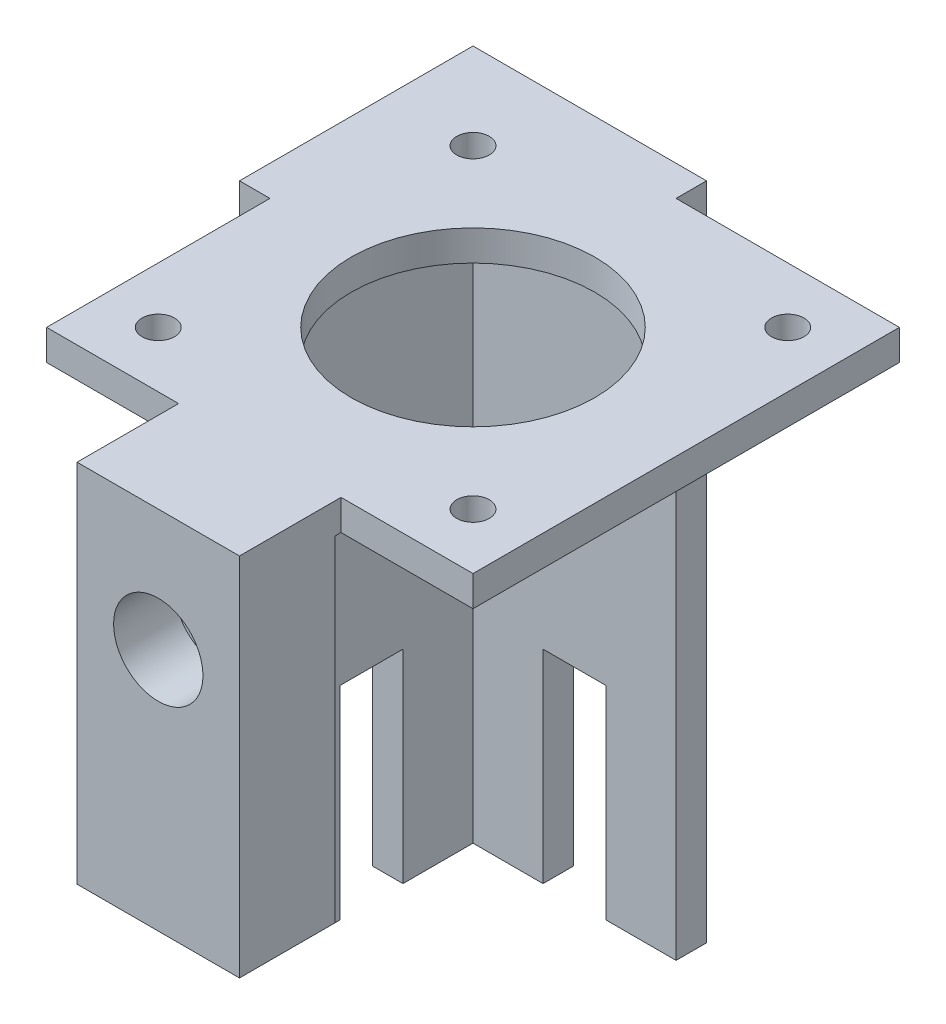
ISO-10303-21;
HEADER;
FILE_DESCRIPTION(('STEP AP214'),'2;1');
FILE_NAME('part.step','',(''),(''),'','','');
FILE_SCHEMA(('AUTOMOTIVE_DESIGN { 1 0 10303 214 1 1 1 1 }'));
ENDSEC;
DATA;
#1=APPLICATION_CONTEXT('core data for automotive mechanical design processes');
#2=APPLICATION_PROTOCOL_DEFINITION('international standard','automotive_design',2000,#1);
#3=PRODUCT_CONTEXT('',#1,'mechanical');
#4=PRODUCT('Part','Part','',(#3));
#5=PRODUCT_RELATED_PRODUCT_CATEGORY('part','',(#4));
#6=PRODUCT_DEFINITION_FORMATION('','',#4);
#7=PRODUCT_DEFINITION_CONTEXT('part definition',#1,'design');
#8=PRODUCT_DEFINITION('design','',#6,#7);
#9=PRODUCT_DEFINITION_SHAPE('','',#8);
#10=(LENGTH_UNIT() NAMED_UNIT(*) SI_UNIT(.MILLI.,.METRE.));
#11=(NAMED_UNIT(*) PLANE_ANGLE_UNIT() SI_UNIT($,.RADIAN.));
#12=(NAMED_UNIT(*) SI_UNIT($,.STERADIAN.) SOLID_ANGLE_UNIT());
#13=UNCERTAINTY_MEASURE_WITH_UNIT(LENGTH_MEASURE(1.E-05),#10,'distance_accuracy_value','');
#14=(GEOMETRIC_REPRESENTATION_CONTEXT(3) GLOBAL_UNCERTAINTY_ASSIGNED_CONTEXT((#13)) GLOBAL_UNIT_ASSIGNED_CONTEXT((#10,
#11,#12)) REPRESENTATION_CONTEXT('',''));
#15=CARTESIAN_POINT('',(0.,0.,0.));
#16=DIRECTION('',(0.,0.,1.));
#17=DIRECTION('',(1.,0.,0.));
#18=AXIS2_PLACEMENT_3D('',#15,#16,#17);
#19=CARTESIAN_POINT('',(-62.,-62.,0.));
#20=DIRECTION('',(0.,-1.,0.));
#21=DIRECTION('',(0.,0.,-1.));
#22=AXIS2_PLACEMENT_3D('',#19,#20,#21);
#23=PLANE('',#22);
#24=DIRECTION('',(-1.,0.,0.));
#25=VECTOR('',#24,1.);
#26=CARTESIAN_POINT('',(-40.999,-62.,-7.89999999999999));
#27=LINE('',#26,#25);
#28=CARTESIAN_POINT('',(-83.,-62.,-7.89999999999999));
#29=VERTEX_POINT('',#28);
#30=CARTESIAN_POINT('',(-86.,-62.,-7.9));
#31=VERTEX_POINT('',#30);
#32=EDGE_CURVE('E505',#29,#31,#27,.T.);
#33=ORIENTED_EDGE('',*,*,#32,.F.);
#34=DIRECTION('',(0.,0.,1.));
#35=VECTOR('',#34,1.);
#36=CARTESIAN_POINT('',(-83.,-62.,-21.));
#37=LINE('',#36,#35);
#38=CARTESIAN_POINT('',(-83.,-62.,-1.));
#39=VERTEX_POINT('',#38);
#40=EDGE_CURVE('E395',#29,#39,#37,.T.);
#41=ORIENTED_EDGE('',*,*,#40,.T.);
#42=DIRECTION('',(-1.,0.,0.));
#43=VECTOR('',#42,1.);
#44=CARTESIAN_POINT('',(-86.,-62.,-1.));
#45=LINE('',#44,#43);
#46=CARTESIAN_POINT('',(-86.,-62.,-1.));
#47=VERTEX_POINT('',#46);
#48=EDGE_CURVE('E541',#39,#47,#45,.T.);
#49=ORIENTED_EDGE('',*,*,#48,.T.);
#50=DIRECTION('',(0.,0.,-1.));
#51=VECTOR('',#50,1.);
#52=CARTESIAN_POINT('',(-86.,-62.,-24.));
#53=LINE('',#52,#51);
#54=EDGE_CURVE('E362',#47,#31,#53,.T.);
#55=ORIENTED_EDGE('',*,*,#54,.T.);
#56=EDGE_LOOP('',(#33,#41,#49,#55));
#57=FACE_BOUND('',#56,.T.);
#58=ADVANCED_FACE('F43',(#57),#23,.T.);
#59=DIRECTION('',(-1.,0.,0.));
#60=VECTOR('',#59,1.);
#61=CARTESIAN_POINT('',(-40.999,-62.,-14.1));
#62=LINE('',#61,#60);
#63=CARTESIAN_POINT('',(-83.,-62.,-14.1));
#64=VERTEX_POINT('',#63);
#65=CARTESIAN_POINT('',(-86.,-62.,-14.1));
#66=VERTEX_POINT('',#65);
#67=EDGE_CURVE('E512',#64,#66,#62,.T.);
#68=ORIENTED_EDGE('',*,*,#67,.T.);
#69=CARTESIAN_POINT('',(-86.,-62.,-24.));
#70=VERTEX_POINT('',#69);
#71=EDGE_CURVE('E369',#66,#70,#53,.T.);
#72=ORIENTED_EDGE('',*,*,#71,.T.);
#73=DIRECTION('',(1.,0.,0.));
#74=VECTOR('',#73,1.);
#75=CARTESIAN_POINT('',(-63.,-62.,-24.));
#76=LINE('',#75,#74);
#77=CARTESIAN_POINT('',(-76.1,-62.,-24.));
#78=VERTEX_POINT('',#77);
#79=EDGE_CURVE('E361',#70,#78,#76,.T.);
#80=ORIENTED_EDGE('',*,*,#79,.T.);
#81=DIRECTION('',(0.,0.,1.));
#82=VECTOR('',#81,1.);
#83=CARTESIAN_POINT('',(-76.1,-62.,0.));
#84=LINE('',#83,#82);
#85=CARTESIAN_POINT('',(-76.1,-62.,-21.));
#86=VERTEX_POINT('',#85);
#87=EDGE_CURVE('E11',#78,#86,#84,.T.);
#88=ORIENTED_EDGE('',*,*,#87,.T.);
#89=DIRECTION('',(-1.,0.,0.));
#90=VECTOR('',#89,1.);
#91=CARTESIAN_POINT('',(-63.,-62.,-21.));
#92=LINE('',#91,#90);
#93=CARTESIAN_POINT('',(-83.,-62.,-21.));
#94=VERTEX_POINT('',#93);
#95=EDGE_CURVE('E375',#86,#94,#92,.T.);
#96=ORIENTED_EDGE('',*,*,#95,.T.);
#97=EDGE_CURVE('E538',#94,#64,#37,.T.);
#98=ORIENTED_EDGE('',*,*,#97,.T.);
#99=EDGE_LOOP('',(#68,#72,#80,#88,#96,#98));
#100=FACE_BOUND('',#99,.T.);
#101=ADVANCED_FACE('F550',(#100),#23,.T.);
#102=CARTESIAN_POINT('',(-41.,3.,21.));
#103=DIRECTION('',(0.,0.,-1.));
#104=DIRECTION('',(1.,0.,0.));
#105=AXIS2_PLACEMENT_3D('',#102,#103,#104);
#106=PLANE('',#105);
#107=DIRECTION('',(0.,1.,0.));
#108=VECTOR('',#107,1.);
#109=CARTESIAN_POINT('',(-70.,3.,21.));
#110=LINE('',#109,#108);
#111=CARTESIAN_POINT('',(-70.,0.,21.));
#112=VERTEX_POINT('',#111);
#113=CARTESIAN_POINT('',(-70.,3.,21.));
#114=VERTEX_POINT('',#113);
#115=EDGE_CURVE('E332',#112,#114,#110,.T.);
#116=ORIENTED_EDGE('',*,*,#115,.T.);
#117=DIRECTION('',(-1.,0.,0.));
#118=VECTOR('',#117,1.);
#119=CARTESIAN_POINT('',(-41.,3.,21.));
#120=LINE('',#119,#118);
#121=CARTESIAN_POINT('',(-83.,3.,21.));
#122=VERTEX_POINT('',#121);
#123=EDGE_CURVE('E301',#114,#122,#120,.T.);
#124=ORIENTED_EDGE('',*,*,#123,.T.);
#125=DIRECTION('',(0.,-1.,0.));
#126=VECTOR('',#125,1.);
#127=CARTESIAN_POINT('',(-83.,3.,21.));
#128=LINE('',#127,#126);
#129=CARTESIAN_POINT('',(-83.,0.,21.));
#130=VERTEX_POINT('',#129);
#131=EDGE_CURVE('E306',#122,#130,#128,.T.);
#132=ORIENTED_EDGE('',*,*,#131,.T.);
#133=DIRECTION('',(-1.,0.,0.));
#134=VECTOR('',#133,1.);
#135=CARTESIAN_POINT('',(-41.,0.,21.));
#136=LINE('',#135,#134);
#137=EDGE_CURVE('E318',#112,#130,#136,.T.);
#138=ORIENTED_EDGE('',*,*,#137,.F.);
#139=EDGE_LOOP('',(#116,#124,#132,#138));
#140=FACE_BOUND('',#139,.T.);
#141=ADVANCED_FACE('F439',(#140),#106,.F.);
#142=DIRECTION('',(0.,-1.,0.));
#143=VECTOR('',#142,1.);
#144=CARTESIAN_POINT('',(-54.,3.,21.));
#145=LINE('',#144,#143);
#146=CARTESIAN_POINT('',(-54.,3.,21.));
#147=VERTEX_POINT('',#146);
#148=CARTESIAN_POINT('',(-54.,0.,21.));
#149=VERTEX_POINT('',#148);
#150=EDGE_CURVE('E240',#147,#149,#145,.T.);
#151=ORIENTED_EDGE('',*,*,#150,.T.);
#152=CARTESIAN_POINT('',(-41.,0.,21.));
#153=VERTEX_POINT('',#152);
#154=EDGE_CURVE('E294',#153,#149,#136,.T.);
#155=ORIENTED_EDGE('',*,*,#154,.F.);
#156=DIRECTION('',(0.,-1.,0.));
#157=VECTOR('',#156,1.);
#158=CARTESIAN_POINT('',(-41.,3.,21.));
#159=LINE('',#158,#157);
#160=CARTESIAN_POINT('',(-41.,3.,21.));
#161=VERTEX_POINT('',#160);
#162=EDGE_CURVE('E325',#161,#153,#159,.T.);
#163=ORIENTED_EDGE('',*,*,#162,.F.);
#164=EDGE_CURVE('E302',#161,#147,#120,.T.);
#165=ORIENTED_EDGE('',*,*,#164,.T.);
#166=EDGE_LOOP('',(#151,#155,#163,#165));
#167=FACE_BOUND('',#166,.T.);
#168=ADVANCED_FACE('F470',(#167),#106,.F.);
#169=CARTESIAN_POINT('',(-62.,3.,0.));
#170=DIRECTION('',(0.,-1.,0.));
#171=DIRECTION('',(0.,0.,-1.));
#172=AXIS2_PLACEMENT_3D('',#169,#170,#171);
#173=PLANE('',#172);
#174=DIRECTION('',(0.,0.,-1.));
#175=VECTOR('',#174,1.);
#176=CARTESIAN_POINT('',(-83.,3.,21.));
#177=LINE('',#176,#175);
#178=CARTESIAN_POINT('',(-83.,3.,-1.));
#179=VERTEX_POINT('',#178);
#180=EDGE_CURVE('E289',#122,#179,#177,.T.);
#181=ORIENTED_EDGE('',*,*,#180,.F.);
#182=ORIENTED_EDGE('',*,*,#123,.F.);
#183=DIRECTION('',(0.,0.,-1.));
#184=VECTOR('',#183,1.);
#185=CARTESIAN_POINT('',(-70.,3.,31.));
#186=LINE('',#185,#184);
#187=CARTESIAN_POINT('',(-70.,3.,31.));
#188=VERTEX_POINT('',#187);
#189=EDGE_CURVE('E245',#188,#114,#186,.T.);
#190=ORIENTED_EDGE('',*,*,#189,.F.);
#191=DIRECTION('',(1.,0.,0.));
#192=VECTOR('',#191,1.);
#193=CARTESIAN_POINT('',(-70.,3.,31.));
#194=LINE('',#193,#192);
#195=CARTESIAN_POINT('',(-54.,3.,31.));
#196=VERTEX_POINT('',#195);
#197=EDGE_CURVE('E428',#188,#196,#194,.T.);
#198=ORIENTED_EDGE('',*,*,#197,.T.);
#199=DIRECTION('',(0.,0.,-1.));
#200=VECTOR('',#199,1.);
#201=CARTESIAN_POINT('',(-54.,3.,31.));
#202=LINE('',#201,#200);
#203=EDGE_CURVE('E235',#196,#147,#202,.T.);
#204=ORIENTED_EDGE('',*,*,#203,.T.);
#205=ORIENTED_EDGE('',*,*,#164,.F.);
#206=DIRECTION('',(0.,0.,1.));
#207=VECTOR('',#206,1.);
#208=CARTESIAN_POINT('',(-41.,3.,21.));
#209=LINE('',#208,#207);
#210=CARTESIAN_POINT('',(-41.,3.,-21.));
#211=VERTEX_POINT('',#210);
#212=EDGE_CURVE('E298',#211,#161,#209,.T.);
#213=ORIENTED_EDGE('',*,*,#212,.F.);
#214=DIRECTION('',(1.,0.,0.));
#215=VECTOR('',#214,1.);
#216=CARTESIAN_POINT('',(-41.,3.,-21.));
#217=LINE('',#216,#215);
#218=CARTESIAN_POINT('',(-63.,3.,-21.));
#219=VERTEX_POINT('',#218);
#220=EDGE_CURVE('E293',#219,#211,#217,.T.);
#221=ORIENTED_EDGE('',*,*,#220,.F.);
#222=DIRECTION('',(0.,0.,1.));
#223=VECTOR('',#222,1.);
#224=CARTESIAN_POINT('',(-63.,3.,-21.));
#225=LINE('',#224,#223);
#226=CARTESIAN_POINT('',(-63.,3.,-24.));
#227=VERTEX_POINT('',#226);
#228=EDGE_CURVE('E391',#227,#219,#225,.T.);
#229=ORIENTED_EDGE('',*,*,#228,.F.);
#230=DIRECTION('',(1.,0.,0.));
#231=VECTOR('',#230,1.);
#232=CARTESIAN_POINT('',(-63.,3.,-24.));
#233=LINE('',#232,#231);
#234=CARTESIAN_POINT('',(-86.,3.,-24.));
#235=VERTEX_POINT('',#234);
#236=EDGE_CURVE('E388',#235,#227,#233,.T.);
#237=ORIENTED_EDGE('',*,*,#236,.F.);
#238=DIRECTION('',(0.,0.,-1.));
#239=VECTOR('',#238,1.);
#240=CARTESIAN_POINT('',(-86.,3.,-24.));
#241=LINE('',#240,#239);
#242=CARTESIAN_POINT('',(-86.,3.,-1.));
#243=VERTEX_POINT('',#242);
#244=EDGE_CURVE('E383',#243,#235,#241,.T.);
#245=ORIENTED_EDGE('',*,*,#244,.F.);
#246=DIRECTION('',(-1.,0.,0.));
#247=VECTOR('',#246,1.);
#248=CARTESIAN_POINT('',(-86.,3.,-1.));
#249=LINE('',#248,#247);
#250=EDGE_CURVE('E379',#179,#243,#249,.T.);
#251=ORIENTED_EDGE('',*,*,#250,.F.);
#252=EDGE_LOOP('',(#181,#182,#190,#198,#204,#205,#213,#221,#229,#237,#245,#251));
#253=FACE_BOUND('',#252,.T.);
#254=CARTESIAN_POINT('',(-77.5,3.,-15.5));
#255=DIRECTION('',(0.,-1.,0.));
#256=DIRECTION('',(0.,0.,1.));
#257=AXIS2_PLACEMENT_3D('',#254,#255,#256);
#258=CIRCLE('',#257,1.6);
#259=CARTESIAN_POINT('',(-77.5,3.,-13.9));
#260=VERTEX_POINT('',#259);
#261=EDGE_CURVE('E281',#260,#260,#258,.T.);
#262=ORIENTED_EDGE('',*,*,#261,.T.);
#263=EDGE_LOOP('',(#262));
#264=FACE_BOUND('',#263,.T.);
#265=CARTESIAN_POINT('',(-62.,3.,0.));
#266=DIRECTION('',(0.,-1.,0.));
#267=DIRECTION('',(0.,0.,1.));
#268=AXIS2_PLACEMENT_3D('',#265,#266,#267);
#269=CIRCLE('',#268,12.);
#270=CARTESIAN_POINT('',(-62.,3.,12.));
#271=VERTEX_POINT('',#270);
#272=EDGE_CURVE('E273',#271,#271,#269,.T.);
#273=ORIENTED_EDGE('',*,*,#272,.T.);
#274=EDGE_LOOP('',(#273));
#275=FACE_BOUND('',#274,.T.);
#276=CARTESIAN_POINT('',(-77.4999999999999,3.,15.5000000000001));
#277=DIRECTION('',(0.,-1.,0.));
#278=DIRECTION('',(0.,0.,1.));
#279=AXIS2_PLACEMENT_3D('',#276,#277,#278);
#280=CIRCLE('',#279,1.6);
#281=CARTESIAN_POINT('',(-77.4999999999999,3.,17.1000000000001));
#282=VERTEX_POINT('',#281);
#283=EDGE_CURVE('E265',#282,#282,#280,.T.);
#284=ORIENTED_EDGE('',*,*,#283,.T.);
#285=EDGE_LOOP('',(#284));
#286=FACE_BOUND('',#285,.T.);
#287=CARTESIAN_POINT('',(-46.4999999999999,3.,15.4999999999999));
#288=DIRECTION('',(0.,-1.,0.));
#289=DIRECTION('',(0.,0.,1.));
#290=AXIS2_PLACEMENT_3D('',#287,#288,#289);
#291=CIRCLE('',#290,1.6);
#292=CARTESIAN_POINT('',(-46.4999999999999,3.,17.0999999999999));
#293=VERTEX_POINT('',#292);
#294=EDGE_CURVE('E257',#293,#293,#291,.T.);
#295=ORIENTED_EDGE('',*,*,#294,.T.);
#296=EDGE_LOOP('',(#295));
#297=FACE_BOUND('',#296,.T.);
#298=CARTESIAN_POINT('',(-46.5000000000002,3.,-15.5000000000002));
#299=DIRECTION('',(0.,-1.,0.));
#300=DIRECTION('',(0.,0.,1.));
#301=AXIS2_PLACEMENT_3D('',#298,#299,#300);
#302=CIRCLE('',#301,1.6);
#303=CARTESIAN_POINT('',(-46.5000000000002,3.,-13.9000000000002));
#304=VERTEX_POINT('',#303);
#305=EDGE_CURVE('E249',#304,#304,#302,.T.);
#306=ORIENTED_EDGE('',*,*,#305,.T.);
#307=EDGE_LOOP('',(#306));
#308=FACE_BOUND('',#307,.T.);
#309=ADVANCED_FACE('F445',(#253,#264,#275,#286,#297,#308),#173,.F.);
#310=CARTESIAN_POINT('',(-62.,0.,0.));
#311=DIRECTION('',(0.,-1.,0.));
#312=DIRECTION('',(0.,0.,-1.));
#313=AXIS2_PLACEMENT_3D('',#310,#311,#312);
#314=PLANE('',#313);
#315=CARTESIAN_POINT('',(-46.4999999999999,0.,15.4999999999999));
#316=DIRECTION('',(0.,-1.,0.));
#317=DIRECTION('',(0.,0.,1.));
#318=AXIS2_PLACEMENT_3D('',#315,#316,#317);
#319=CIRCLE('',#318,1.6);
#320=CARTESIAN_POINT('',(-46.4999999999999,0.,17.0999999999999));
#321=VERTEX_POINT('',#320);
#322=EDGE_CURVE('E253',#321,#321,#319,.T.);
#323=ORIENTED_EDGE('',*,*,#322,.F.);
#324=EDGE_LOOP('',(#323));
#325=FACE_BOUND('',#324,.T.);
#326=CARTESIAN_POINT('',(-62.,0.,0.));
#327=DIRECTION('',(0.,-1.,0.));
#328=DIRECTION('',(0.,0.,1.));
#329=AXIS2_PLACEMENT_3D('',#326,#327,#328);
#330=CIRCLE('',#329,12.);
#331=CARTESIAN_POINT('',(-62.,0.,12.));
#332=VERTEX_POINT('',#331);
#333=EDGE_CURVE('E269',#332,#332,#330,.T.);
#334=ORIENTED_EDGE('',*,*,#333,.F.);
#335=EDGE_LOOP('',(#334));
#336=FACE_BOUND('',#335,.T.);
#337=DIRECTION('',(0.,0.,-1.));
#338=VECTOR('',#337,1.);
#339=CARTESIAN_POINT('',(-83.,0.,21.));
#340=LINE('',#339,#338);
#341=CARTESIAN_POINT('',(-83.,0.,-1.));
#342=VERTEX_POINT('',#341);
#343=EDGE_CURVE('E285',#130,#342,#340,.T.);
#344=ORIENTED_EDGE('',*,*,#343,.T.);
#345=DIRECTION('',(0.,0.,-1.));
#346=VECTOR('',#345,1.);
#347=CARTESIAN_POINT('',(-83.,0.,0.));
#348=LINE('',#347,#346);
#349=CARTESIAN_POINT('',(-83.,0.,-21.));
#350=VERTEX_POINT('',#349);
#351=EDGE_CURVE('E399',#342,#350,#348,.T.);
#352=ORIENTED_EDGE('',*,*,#351,.T.);
#353=DIRECTION('',(1.,0.,0.));
#354=VECTOR('',#353,1.);
#355=CARTESIAN_POINT('',(-41.,0.,-21.));
#356=LINE('',#355,#354);
#357=CARTESIAN_POINT('',(-63.,0.,-21.));
#358=VERTEX_POINT('',#357);
#359=EDGE_CURVE('E311',#350,#358,#356,.T.);
#360=ORIENTED_EDGE('',*,*,#359,.T.);
#361=CARTESIAN_POINT('',(-41.,0.,-21.));
#362=VERTEX_POINT('',#361);
#363=EDGE_CURVE('E310',#358,#362,#356,.T.);
#364=ORIENTED_EDGE('',*,*,#363,.T.);
#365=DIRECTION('',(0.,0.,1.));
#366=VECTOR('',#365,1.);
#367=CARTESIAN_POINT('',(-41.,0.,21.));
#368=LINE('',#367,#366);
#369=EDGE_CURVE('E315',#362,#153,#368,.T.);
#370=ORIENTED_EDGE('',*,*,#369,.T.);
#371=ORIENTED_EDGE('',*,*,#154,.T.);
#372=DIRECTION('',(0.,0.,1.));
#373=VECTOR('',#372,1.);
#374=CARTESIAN_POINT('',(-54.,0.,21.));
#375=LINE('',#374,#373);
#376=CARTESIAN_POINT('',(-54.,0.,21.6));
#377=VERTEX_POINT('',#376);
#378=EDGE_CURVE('E473',#149,#377,#375,.T.);
#379=ORIENTED_EDGE('',*,*,#378,.T.);
#380=DIRECTION('',(-1.,0.,0.));
#381=VECTOR('',#380,1.);
#382=CARTESIAN_POINT('',(-70.,0.,21.6));
#383=LINE('',#382,#381);
#384=CARTESIAN_POINT('',(-70.,0.,21.6));
#385=VERTEX_POINT('',#384);
#386=EDGE_CURVE('E474',#377,#385,#383,.T.);
#387=ORIENTED_EDGE('',*,*,#386,.T.);
#388=DIRECTION('',(0.,0.,-1.));
#389=VECTOR('',#388,1.);
#390=CARTESIAN_POINT('',(-70.,0.,21.));
#391=LINE('',#390,#389);
#392=EDGE_CURVE('E223',#385,#112,#391,.T.);
#393=ORIENTED_EDGE('',*,*,#392,.T.);
#394=ORIENTED_EDGE('',*,*,#137,.T.);
#395=EDGE_LOOP('',(#344,#352,#360,#364,#370,#371,#379,#387,#393,#394));
#396=FACE_BOUND('',#395,.T.);
#397=CARTESIAN_POINT('',(-77.5,0.,-15.5));
#398=DIRECTION('',(0.,-1.,0.));
#399=DIRECTION('',(0.,0.,1.));
#400=AXIS2_PLACEMENT_3D('',#397,#398,#399);
#401=CIRCLE('',#400,1.6);
#402=CARTESIAN_POINT('',(-77.5,0.,-13.9));
#403=VERTEX_POINT('',#402);
#404=EDGE_CURVE('E277',#403,#403,#401,.T.);
#405=ORIENTED_EDGE('',*,*,#404,.F.);
#406=EDGE_LOOP('',(#405));
#407=FACE_BOUND('',#406,.T.);
#408=CARTESIAN_POINT('',(-77.4999999999999,0.,15.5000000000001));
#409=DIRECTION('',(0.,-1.,0.));
#410=DIRECTION('',(0.,0.,1.));
#411=AXIS2_PLACEMENT_3D('',#408,#409,#410);
#412=CIRCLE('',#411,1.6);
#413=CARTESIAN_POINT('',(-77.4999999999999,0.,17.1000000000001));
#414=VERTEX_POINT('',#413);
#415=EDGE_CURVE('E261',#414,#414,#412,.T.);
#416=ORIENTED_EDGE('',*,*,#415,.F.);
#417=EDGE_LOOP('',(#416));
#418=FACE_BOUND('',#417,.T.);
#419=CARTESIAN_POINT('',(-46.5000000000002,0.,-15.5000000000002));
#420=DIRECTION('',(0.,-1.,0.));
#421=DIRECTION('',(0.,0.,1.));
#422=AXIS2_PLACEMENT_3D('',#419,#420,#421);
#423=CIRCLE('',#422,1.6);
#424=CARTESIAN_POINT('',(-46.5000000000002,0.,-13.9000000000002));
#425=VERTEX_POINT('',#424);
#426=EDGE_CURVE('E248',#425,#425,#423,.T.);
#427=ORIENTED_EDGE('',*,*,#426,.F.);
#428=EDGE_LOOP('',(#427));
#429=FACE_BOUND('',#428,.T.);
#430=ADVANCED_FACE('F455',(#325,#336,#396,#407,#418,#429),#314,.T.);
#431=CARTESIAN_POINT('',(-83.,3.,21.));
#432=DIRECTION('',(1.,0.,0.));
#433=DIRECTION('',(0.,0.,1.));
#434=AXIS2_PLACEMENT_3D('',#431,#432,#433);
#435=PLANE('',#434);
#436=ORIENTED_EDGE('',*,*,#343,.F.);
#437=ORIENTED_EDGE('',*,*,#131,.F.);
#438=ORIENTED_EDGE('',*,*,#180,.T.);
#439=DIRECTION('',(0.,1.,0.));
#440=VECTOR('',#439,1.);
#441=CARTESIAN_POINT('',(-83.,-62.,-1.));
#442=LINE('',#441,#440);
#443=EDGE_CURVE('E378',#342,#179,#442,.T.);
#444=ORIENTED_EDGE('',*,*,#443,.F.);
#445=EDGE_LOOP('',(#436,#437,#438,#444));
#446=FACE_BOUND('',#445,.T.);
#447=ADVANCED_FACE('F45',(#446),#435,.F.);
#448=CARTESIAN_POINT('',(-41.,3.,-21.));
#449=DIRECTION('',(0.,0.,1.));
#450=DIRECTION('',(-1.,0.,0.));
#451=AXIS2_PLACEMENT_3D('',#448,#449,#450);
#452=PLANE('',#451);
#453=ORIENTED_EDGE('',*,*,#220,.T.);
#454=DIRECTION('',(0.,-1.,0.));
#455=VECTOR('',#454,1.);
#456=CARTESIAN_POINT('',(-41.,3.,-21.));
#457=LINE('',#456,#455);
#458=EDGE_CURVE('E329',#211,#362,#457,.T.);
#459=ORIENTED_EDGE('',*,*,#458,.T.);
#460=ORIENTED_EDGE('',*,*,#363,.F.);
#461=DIRECTION('',(0.,-1.,0.));
#462=VECTOR('',#461,1.);
#463=CARTESIAN_POINT('',(-63.,3.,-21.));
#464=LINE('',#463,#462);
#465=EDGE_CURVE('E333',#219,#358,#464,.T.);
#466=ORIENTED_EDGE('',*,*,#465,.F.);
#467=EDGE_LOOP('',(#453,#459,#460,#466));
#468=FACE_BOUND('',#467,.T.);
#469=ADVANCED_FACE('F460',(#468),#452,.F.);
#470=CARTESIAN_POINT('',(-41.,3.,21.));
#471=DIRECTION('',(-1.,0.,0.));
#472=DIRECTION('',(0.,0.,-1.));
#473=AXIS2_PLACEMENT_3D('',#470,#471,#472);
#474=PLANE('',#473);
#475=ORIENTED_EDGE('',*,*,#369,.F.);
#476=ORIENTED_EDGE('',*,*,#458,.F.);
#477=ORIENTED_EDGE('',*,*,#212,.T.);
#478=ORIENTED_EDGE('',*,*,#162,.T.);
#479=EDGE_LOOP('',(#475,#476,#477,#478));
#480=FACE_BOUND('',#479,.T.);
#481=ADVANCED_FACE('F464',(#480),#474,.F.);
#482=CARTESIAN_POINT('',(-77.5,3.,-15.5));
#483=DIRECTION('',(0.,-1.,0.));
#484=DIRECTION('',(0.,0.,-1.));
#485=AXIS2_PLACEMENT_3D('',#482,#483,#484);
#486=CYLINDRICAL_SURFACE('',#485,1.6);
#487=ORIENTED_EDGE('',*,*,#261,.F.);
#488=EDGE_LOOP('',(#487));
#489=FACE_BOUND('',#488,.T.);
#490=ORIENTED_EDGE('',*,*,#404,.T.);
#491=EDGE_LOOP('',(#490));
#492=FACE_BOUND('',#491,.T.);
#493=ADVANCED_FACE('F848',(#489,#492),#486,.F.);
#494=CARTESIAN_POINT('',(-62.,3.,0.));
#495=DIRECTION('',(0.,-1.,0.));
#496=DIRECTION('',(0.,0.,-1.));
#497=AXIS2_PLACEMENT_3D('',#494,#495,#496);
#498=CYLINDRICAL_SURFACE('',#497,12.);
#499=ORIENTED_EDGE('',*,*,#272,.F.);
#500=EDGE_LOOP('',(#499));
#501=FACE_BOUND('',#500,.T.);
#502=ORIENTED_EDGE('',*,*,#333,.T.);
#503=EDGE_LOOP('',(#502));
#504=FACE_BOUND('',#503,.T.);
#505=ADVANCED_FACE('F837',(#501,#504),#498,.F.);
#506=CARTESIAN_POINT('',(-77.4999999999999,3.,15.5000000000001));
#507=DIRECTION('',(0.,-1.,0.));
#508=DIRECTION('',(0.,0.,-1.));
#509=AXIS2_PLACEMENT_3D('',#506,#507,#508);
#510=CYLINDRICAL_SURFACE('',#509,1.6);
#511=ORIENTED_EDGE('',*,*,#283,.F.);
#512=EDGE_LOOP('',(#511));
#513=FACE_BOUND('',#512,.T.);
#514=ORIENTED_EDGE('',*,*,#415,.T.);
#515=EDGE_LOOP('',(#514));
#516=FACE_BOUND('',#515,.T.);
#517=ADVANCED_FACE('F826',(#513,#516),#510,.F.);
#518=CARTESIAN_POINT('',(-46.4999999999999,3.,15.4999999999999));
#519=DIRECTION('',(0.,-1.,0.));
#520=DIRECTION('',(0.,0.,-1.));
#521=AXIS2_PLACEMENT_3D('',#518,#519,#520);
#522=CYLINDRICAL_SURFACE('',#521,1.6);
#523=ORIENTED_EDGE('',*,*,#294,.F.);
#524=EDGE_LOOP('',(#523));
#525=FACE_BOUND('',#524,.T.);
#526=ORIENTED_EDGE('',*,*,#322,.T.);
#527=EDGE_LOOP('',(#526));
#528=FACE_BOUND('',#527,.T.);
#529=ADVANCED_FACE('F815',(#525,#528),#522,.F.);
#530=CARTESIAN_POINT('',(-46.5000000000002,3.,-15.5000000000002));
#531=DIRECTION('',(0.,-1.,0.));
#532=DIRECTION('',(0.,0.,-1.));
#533=AXIS2_PLACEMENT_3D('',#530,#531,#532);
#534=CYLINDRICAL_SURFACE('',#533,1.6);
#535=ORIENTED_EDGE('',*,*,#305,.F.);
#536=EDGE_LOOP('',(#535));
#537=FACE_BOUND('',#536,.T.);
#538=ORIENTED_EDGE('',*,*,#426,.T.);
#539=EDGE_LOOP('',(#538));
#540=FACE_BOUND('',#539,.T.);
#541=ADVANCED_FACE('F805',(#537,#540),#534,.F.);
#542=CARTESIAN_POINT('',(-70.,3.,31.));
#543=DIRECTION('',(1.,0.,0.));
#544=DIRECTION('',(0.,-1.,0.));
#545=AXIS2_PLACEMENT_3D('',#542,#543,#544);
#546=PLANE('',#545);
#547=DIRECTION('',(0.,0.,-1.));
#548=VECTOR('',#547,1.);
#549=CARTESIAN_POINT('',(-70.,-33.,31.));
#550=LINE('',#549,#548);
#551=CARTESIAN_POINT('',(-70.,-33.,31.));
#552=VERTEX_POINT('',#551);
#553=CARTESIAN_POINT('',(-70.,-33.,21.6));
#554=VERTEX_POINT('',#553);
#555=EDGE_CURVE('E221',#552,#554,#550,.T.);
#556=ORIENTED_EDGE('',*,*,#555,.F.);
#557=DIRECTION('',(0.,1.,0.));
#558=VECTOR('',#557,1.);
#559=CARTESIAN_POINT('',(-70.,3.,31.));
#560=LINE('',#559,#558);
#561=EDGE_CURVE('E425',#552,#188,#560,.T.);
#562=ORIENTED_EDGE('',*,*,#561,.T.);
#563=ORIENTED_EDGE('',*,*,#189,.T.);
#564=ORIENTED_EDGE('',*,*,#115,.F.);
#565=ORIENTED_EDGE('',*,*,#392,.F.);
#566=DIRECTION('',(0.,-1.,0.));
#567=VECTOR('',#566,1.);
#568=CARTESIAN_POINT('',(-70.,16.0112460477004,21.6));
#569=LINE('',#568,#567);
#570=EDGE_CURVE('E209',#385,#554,#569,.T.);
#571=ORIENTED_EDGE('',*,*,#570,.T.);
#572=EDGE_LOOP('',(#556,#562,#563,#564,#565,#571));
#573=FACE_BOUND('',#572,.T.);
#574=ADVANCED_FACE('F220',(#573),#546,.F.);
#575=CARTESIAN_POINT('',(-54.,3.,31.));
#576=DIRECTION('',(-1.,0.,0.));
#577=DIRECTION('',(0.,1.,0.));
#578=AXIS2_PLACEMENT_3D('',#575,#576,#577);
#579=PLANE('',#578);
#580=ORIENTED_EDGE('',*,*,#378,.F.);
#581=ORIENTED_EDGE('',*,*,#150,.F.);
#582=ORIENTED_EDGE('',*,*,#203,.F.);
#583=DIRECTION('',(0.,-1.,0.));
#584=VECTOR('',#583,1.);
#585=CARTESIAN_POINT('',(-54.,3.,31.));
#586=LINE('',#585,#584);
#587=CARTESIAN_POINT('',(-54.,-33.,31.));
#588=VERTEX_POINT('',#587);
#589=EDGE_CURVE('E237',#196,#588,#586,.T.);
#590=ORIENTED_EDGE('',*,*,#589,.T.);
#591=DIRECTION('',(0.,0.,-1.));
#592=VECTOR('',#591,1.);
#593=CARTESIAN_POINT('',(-54.,-33.,31.));
#594=LINE('',#593,#592);
#595=CARTESIAN_POINT('',(-54.,-33.,21.6));
#596=VERTEX_POINT('',#595);
#597=EDGE_CURVE('E231',#588,#596,#594,.T.);
#598=ORIENTED_EDGE('',*,*,#597,.T.);
#599=DIRECTION('',(0.,-1.,0.));
#600=VECTOR('',#599,1.);
#601=CARTESIAN_POINT('',(-54.,16.0112460477004,21.6));
#602=LINE('',#601,#600);
#603=EDGE_CURVE('E211',#377,#596,#602,.T.);
#604=ORIENTED_EDGE('',*,*,#603,.F.);
#605=EDGE_LOOP('',(#580,#581,#582,#590,#598,#604));
#606=FACE_BOUND('',#605,.T.);
#607=ADVANCED_FACE('F582',(#606),#579,.F.);
#608=CARTESIAN_POINT('',(-70.,-33.,31.));
#609=DIRECTION('',(0.,1.,0.));
#610=DIRECTION('',(0.,0.,1.));
#611=AXIS2_PLACEMENT_3D('',#608,#609,#610);
#612=PLANE('',#611);
#613=ORIENTED_EDGE('',*,*,#597,.F.);
#614=DIRECTION('',(-1.,0.,0.));
#615=VECTOR('',#614,1.);
#616=CARTESIAN_POINT('',(-70.,-33.,31.));
#617=LINE('',#616,#615);
#618=EDGE_CURVE('E228',#588,#552,#617,.T.);
#619=ORIENTED_EDGE('',*,*,#618,.T.);
#620=ORIENTED_EDGE('',*,*,#555,.T.);
#621=DIRECTION('',(1.,0.,0.));
#622=VECTOR('',#621,1.);
#623=CARTESIAN_POINT('',(-70.,-33.,21.6));
#624=LINE('',#623,#622);
#625=EDGE_CURVE('E205',#554,#596,#624,.T.);
#626=ORIENTED_EDGE('',*,*,#625,.T.);
#627=EDGE_LOOP('',(#613,#619,#620,#626));
#628=FACE_BOUND('',#627,.T.);
#629=ADVANCED_FACE('F227',(#628),#612,.F.);
#630=CARTESIAN_POINT('',(-62.,0.,31.));
#631=DIRECTION('',(0.,0.,-1.));
#632=DIRECTION('',(1.,0.,0.));
#633=AXIS2_PLACEMENT_3D('',#630,#631,#632);
#634=PLANE('',#633);
#635=CARTESIAN_POINT('',(-62.,-9.,31.));
#636=DIRECTION('',(0.,0.,-1.));
#637=DIRECTION('',(-1.,0.,0.));
#638=AXIS2_PLACEMENT_3D('',#635,#636,#637);
#639=CIRCLE('',#638,4.4);
#640=CARTESIAN_POINT('',(-66.4,-9.,31.));
#641=VERTEX_POINT('',#640);
#642=EDGE_CURVE('E417',#641,#641,#639,.T.);
#643=ORIENTED_EDGE('',*,*,#642,.T.);
#644=EDGE_LOOP('',(#643));
#645=FACE_BOUND('',#644,.T.);
#646=ORIENTED_EDGE('',*,*,#561,.F.);
#647=ORIENTED_EDGE('',*,*,#618,.F.);
#648=ORIENTED_EDGE('',*,*,#589,.F.);
#649=ORIENTED_EDGE('',*,*,#197,.F.);
#650=EDGE_LOOP('',(#646,#647,#648,#649));
#651=FACE_BOUND('',#650,.T.);
#652=ADVANCED_FACE('F584',(#645,#651),#634,.F.);
#653=CARTESIAN_POINT('',(-62.,-9.,25.));
#654=DIRECTION('',(0.,0.,1.));
#655=DIRECTION('',(-1.,0.,0.));
#656=AXIS2_PLACEMENT_3D('',#653,#654,#655);
#657=CYLINDRICAL_SURFACE('',#656,4.4);
#658=CARTESIAN_POINT('',(-62.,-9.,25.));
#659=DIRECTION('',(0.,0.,-1.));
#660=DIRECTION('',(-1.,0.,0.));
#661=AXIS2_PLACEMENT_3D('',#658,#659,#660);
#662=CIRCLE('',#661,4.4);
#663=CARTESIAN_POINT('',(-66.4,-9.,25.));
#664=VERTEX_POINT('',#663);
#665=EDGE_CURVE('E418',#664,#664,#662,.T.);
#666=ORIENTED_EDGE('',*,*,#665,.T.);
#667=EDGE_LOOP('',(#666));
#668=FACE_BOUND('',#667,.T.);
#669=ORIENTED_EDGE('',*,*,#642,.F.);
#670=EDGE_LOOP('',(#669));
#671=FACE_BOUND('',#670,.T.);
#672=ADVANCED_FACE('F586',(#668,#671),#657,.F.);
#673=CARTESIAN_POINT('',(-62.,-9.,25.));
#674=DIRECTION('',(0.,0.,1.));
#675=DIRECTION('',(-1.,0.,0.));
#676=AXIS2_PLACEMENT_3D('',#673,#674,#675);
#677=PLANE('',#676);
#678=ORIENTED_EDGE('',*,*,#665,.F.);
#679=EDGE_LOOP('',(#678));
#680=FACE_BOUND('',#679,.T.);
#681=ADVANCED_FACE('F593',(#680),#677,.T.);
#682=CARTESIAN_POINT('',(-83.,-62.,-21.));
#683=DIRECTION('',(1.,0.,0.));
#684=DIRECTION('',(0.,0.,1.));
#685=AXIS2_PLACEMENT_3D('',#682,#683,#684);
#686=PLANE('',#685);
#687=DIRECTION('',(0.,-1.,0.));
#688=VECTOR('',#687,1.);
#689=CARTESIAN_POINT('',(-83.,-62.,-7.9));
#690=LINE('',#689,#688);
#691=CARTESIAN_POINT('',(-83.,-42.,-7.89999999999999));
#692=VERTEX_POINT('',#691);
#693=EDGE_CURVE('E493',#692,#29,#690,.T.);
#694=ORIENTED_EDGE('',*,*,#693,.F.);
#695=DIRECTION('',(0.,0.,1.));
#696=VECTOR('',#695,1.);
#697=CARTESIAN_POINT('',(-83.,-42.,-7.89999999999999));
#698=LINE('',#697,#696);
#699=CARTESIAN_POINT('',(-83.,-42.,-14.1));
#700=VERTEX_POINT('',#699);
#701=EDGE_CURVE('E489',#700,#692,#698,.T.);
#702=ORIENTED_EDGE('',*,*,#701,.F.);
#703=DIRECTION('',(0.,1.,0.));
#704=VECTOR('',#703,1.);
#705=CARTESIAN_POINT('',(-83.,-62.,-14.1));
#706=LINE('',#705,#704);
#707=EDGE_CURVE('E485',#64,#700,#706,.T.);
#708=ORIENTED_EDGE('',*,*,#707,.F.);
#709=ORIENTED_EDGE('',*,*,#97,.F.);
#710=DIRECTION('',(0.,1.,0.));
#711=VECTOR('',#710,1.);
#712=CARTESIAN_POINT('',(-83.,-62.,-21.));
#713=LINE('',#712,#711);
#714=EDGE_CURVE('E396',#94,#350,#713,.T.);
#715=ORIENTED_EDGE('',*,*,#714,.T.);
#716=ORIENTED_EDGE('',*,*,#351,.F.);
#717=EDGE_CURVE('E411',#39,#342,#442,.T.);
#718=ORIENTED_EDGE('',*,*,#717,.F.);
#719=ORIENTED_EDGE('',*,*,#40,.F.);
#720=EDGE_LOOP('',(#694,#702,#708,#709,#715,#716,#718,#719));
#721=FACE_BOUND('',#720,.T.);
#722=ADVANCED_FACE('F574',(#721),#686,.T.);
#723=CARTESIAN_POINT('',(-63.,-62.,-21.));
#724=DIRECTION('',(0.,0.,1.));
#725=DIRECTION('',(-1.,0.,0.));
#726=AXIS2_PLACEMENT_3D('',#723,#724,#725);
#727=PLANE('',#726);
#728=DIRECTION('',(0.,1.,0.));
#729=VECTOR('',#728,1.);
#730=CARTESIAN_POINT('',(-76.1,-62.,-21.));
#731=LINE('',#730,#729);
#732=CARTESIAN_POINT('',(-76.1,-42.,-21.));
#733=VERTEX_POINT('',#732);
#734=EDGE_CURVE('E531',#86,#733,#731,.T.);
#735=ORIENTED_EDGE('',*,*,#734,.T.);
#736=DIRECTION('',(1.,0.,0.));
#737=VECTOR('',#736,1.);
#738=CARTESIAN_POINT('',(-63.,-42.,-21.));
#739=LINE('',#738,#737);
#740=CARTESIAN_POINT('',(-69.9,-42.,-21.));
#741=VERTEX_POINT('',#740);
#742=EDGE_CURVE('E384',#733,#741,#739,.T.);
#743=ORIENTED_EDGE('',*,*,#742,.T.);
#744=DIRECTION('',(0.,-1.,0.));
#745=VECTOR('',#744,1.);
#746=CARTESIAN_POINT('',(-69.9,-62.,-21.));
#747=LINE('',#746,#745);
#748=CARTESIAN_POINT('',(-69.9,-62.,-21.));
#749=VERTEX_POINT('',#748);
#750=EDGE_CURVE('E526',#741,#749,#747,.T.);
#751=ORIENTED_EDGE('',*,*,#750,.T.);
#752=CARTESIAN_POINT('',(-63.,-62.,-21.));
#753=VERTEX_POINT('',#752);
#754=EDGE_CURVE('E343',#753,#749,#92,.T.);
#755=ORIENTED_EDGE('',*,*,#754,.F.);
#756=DIRECTION('',(0.,1.,0.));
#757=VECTOR('',#756,1.);
#758=CARTESIAN_POINT('',(-63.,-62.,-21.));
#759=LINE('',#758,#757);
#760=EDGE_CURVE('E400',#753,#358,#759,.T.);
#761=ORIENTED_EDGE('',*,*,#760,.T.);
#762=ORIENTED_EDGE('',*,*,#359,.F.);
#763=ORIENTED_EDGE('',*,*,#714,.F.);
#764=ORIENTED_EDGE('',*,*,#95,.F.);
#765=EDGE_LOOP('',(#735,#743,#751,#755,#761,#762,#763,#764));
#766=FACE_BOUND('',#765,.T.);
#767=ADVANCED_FACE('F576',(#766),#727,.T.);
#768=CARTESIAN_POINT('',(-63.,-62.,-21.));
#769=DIRECTION('',(1.,0.,0.));
#770=DIRECTION('',(0.,0.,1.));
#771=AXIS2_PLACEMENT_3D('',#768,#769,#770);
#772=PLANE('',#771);
#773=ORIENTED_EDGE('',*,*,#228,.T.);
#774=ORIENTED_EDGE('',*,*,#465,.T.);
#775=ORIENTED_EDGE('',*,*,#760,.F.);
#776=DIRECTION('',(0.,0.,1.));
#777=VECTOR('',#776,1.);
#778=CARTESIAN_POINT('',(-63.,-62.,-21.));
#779=LINE('',#778,#777);
#780=CARTESIAN_POINT('',(-63.,-62.,-24.));
#781=VERTEX_POINT('',#780);
#782=EDGE_CURVE('E367',#781,#753,#779,.T.);
#783=ORIENTED_EDGE('',*,*,#782,.F.);
#784=DIRECTION('',(0.,1.,0.));
#785=VECTOR('',#784,1.);
#786=CARTESIAN_POINT('',(-63.,-62.,-24.));
#787=LINE('',#786,#785);
#788=EDGE_CURVE('E358',#781,#227,#787,.T.);
#789=ORIENTED_EDGE('',*,*,#788,.T.);
#790=EDGE_LOOP('',(#773,#774,#775,#783,#789));
#791=FACE_BOUND('',#790,.T.);
#792=ADVANCED_FACE('F579',(#791),#772,.T.);
#793=CARTESIAN_POINT('',(-63.,-62.,-24.));
#794=DIRECTION('',(0.,0.,-1.));
#795=DIRECTION('',(1.,0.,0.));
#796=AXIS2_PLACEMENT_3D('',#793,#794,#795);
#797=PLANE('',#796);
#798=DIRECTION('',(0.,-1.,0.));
#799=VECTOR('',#798,1.);
#800=CARTESIAN_POINT('',(-76.1,-62.,-24.));
#801=LINE('',#800,#799);
#802=CARTESIAN_POINT('',(-76.1,-42.,-24.));
#803=VERTEX_POINT('',#802);
#804=EDGE_CURVE('E354',#803,#78,#801,.T.);
#805=ORIENTED_EDGE('',*,*,#804,.T.);
#806=ORIENTED_EDGE('',*,*,#79,.F.);
#807=DIRECTION('',(0.,1.,0.));
#808=VECTOR('',#807,1.);
#809=CARTESIAN_POINT('',(-86.,-62.,-24.));
#810=LINE('',#809,#808);
#811=EDGE_CURVE('E405',#70,#235,#810,.T.);
#812=ORIENTED_EDGE('',*,*,#811,.T.);
#813=ORIENTED_EDGE('',*,*,#236,.T.);
#814=ORIENTED_EDGE('',*,*,#788,.F.);
#815=CARTESIAN_POINT('',(-69.9,-62.,-24.));
#816=VERTEX_POINT('',#815);
#817=EDGE_CURVE('E340',#816,#781,#76,.T.);
#818=ORIENTED_EDGE('',*,*,#817,.F.);
#819=DIRECTION('',(0.,1.,0.));
#820=VECTOR('',#819,1.);
#821=CARTESIAN_POINT('',(-69.9,-62.,-24.));
#822=LINE('',#821,#820);
#823=CARTESIAN_POINT('',(-69.9,-42.,-24.));
#824=VERTEX_POINT('',#823);
#825=EDGE_CURVE('E346',#816,#824,#822,.T.);
#826=ORIENTED_EDGE('',*,*,#825,.T.);
#827=DIRECTION('',(-1.,0.,0.));
#828=VECTOR('',#827,1.);
#829=CARTESIAN_POINT('',(-76.1,-42.,-24.));
#830=LINE('',#829,#828);
#831=EDGE_CURVE('E353',#824,#803,#830,.T.);
#832=ORIENTED_EDGE('',*,*,#831,.T.);
#833=EDGE_LOOP('',(#805,#806,#812,#813,#814,#818,#826,#832));
#834=FACE_BOUND('',#833,.T.);
#835=ADVANCED_FACE('F356',(#834),#797,.T.);
#836=CARTESIAN_POINT('',(-86.,-62.,-24.));
#837=DIRECTION('',(-1.,0.,0.));
#838=DIRECTION('',(0.,0.,-1.));
#839=AXIS2_PLACEMENT_3D('',#836,#837,#838);
#840=PLANE('',#839);
#841=DIRECTION('',(0.,-1.,0.));
#842=VECTOR('',#841,1.);
#843=CARTESIAN_POINT('',(-86.,-62.,-7.9));
#844=LINE('',#843,#842);
#845=CARTESIAN_POINT('',(-86.,-42.,-7.9));
#846=VERTEX_POINT('',#845);
#847=EDGE_CURVE('E496',#846,#31,#844,.T.);
#848=ORIENTED_EDGE('',*,*,#847,.T.);
#849=ORIENTED_EDGE('',*,*,#54,.F.);
#850=DIRECTION('',(0.,1.,0.));
#851=VECTOR('',#850,1.);
#852=CARTESIAN_POINT('',(-86.,-62.,-1.));
#853=LINE('',#852,#851);
#854=EDGE_CURVE('E408',#47,#243,#853,.T.);
#855=ORIENTED_EDGE('',*,*,#854,.T.);
#856=ORIENTED_EDGE('',*,*,#244,.T.);
#857=ORIENTED_EDGE('',*,*,#811,.F.);
#858=ORIENTED_EDGE('',*,*,#71,.F.);
#859=DIRECTION('',(0.,1.,0.));
#860=VECTOR('',#859,1.);
#861=CARTESIAN_POINT('',(-86.,-62.,-14.1));
#862=LINE('',#861,#860);
#863=CARTESIAN_POINT('',(-86.,-42.,-14.1));
#864=VERTEX_POINT('',#863);
#865=EDGE_CURVE('E59',#66,#864,#862,.T.);
#866=ORIENTED_EDGE('',*,*,#865,.T.);
#867=DIRECTION('',(0.,0.,1.));
#868=VECTOR('',#867,1.);
#869=CARTESIAN_POINT('',(-86.,-42.,-7.9));
#870=LINE('',#869,#868);
#871=EDGE_CURVE('E501',#864,#846,#870,.T.);
#872=ORIENTED_EDGE('',*,*,#871,.T.);
#873=EDGE_LOOP('',(#848,#849,#855,#856,#857,#858,#866,#872));
#874=FACE_BOUND('',#873,.T.);
#875=ADVANCED_FACE('F553',(#874),#840,.T.);
#876=CARTESIAN_POINT('',(-86.,-62.,-1.));
#877=DIRECTION('',(0.,0.,1.));
#878=DIRECTION('',(-1.,0.,0.));
#879=AXIS2_PLACEMENT_3D('',#876,#877,#878);
#880=PLANE('',#879);
#881=ORIENTED_EDGE('',*,*,#250,.T.);
#882=ORIENTED_EDGE('',*,*,#854,.F.);
#883=ORIENTED_EDGE('',*,*,#48,.F.);
#884=ORIENTED_EDGE('',*,*,#717,.T.);
#885=ORIENTED_EDGE('',*,*,#443,.T.);
#886=EDGE_LOOP('',(#881,#882,#883,#884,#885));
#887=FACE_BOUND('',#886,.T.);
#888=ADVANCED_FACE('F569',(#887),#880,.T.);
#889=DIRECTION('',(0.,0.,-1.));
#890=VECTOR('',#889,1.);
#891=CARTESIAN_POINT('',(-69.9,-62.,0.));
#892=LINE('',#891,#890);
#893=EDGE_CURVE('E52',#749,#816,#892,.T.);
#894=ORIENTED_EDGE('',*,*,#893,.T.);
#895=ORIENTED_EDGE('',*,*,#817,.T.);
#896=ORIENTED_EDGE('',*,*,#782,.T.);
#897=ORIENTED_EDGE('',*,*,#754,.T.);
#898=EDGE_LOOP('',(#894,#895,#896,#897));
#899=FACE_BOUND('',#898,.T.);
#900=ADVANCED_FACE('F338',(#899),#23,.T.);
#901=CARTESIAN_POINT('',(-76.1,-62.,26.));
#902=DIRECTION('',(-1.,0.,0.));
#903=DIRECTION('',(0.,0.,-1.));
#904=AXIS2_PLACEMENT_3D('',#901,#902,#903);
#905=PLANE('',#904);
#906=ORIENTED_EDGE('',*,*,#734,.F.);
#907=ORIENTED_EDGE('',*,*,#87,.F.);
#908=ORIENTED_EDGE('',*,*,#804,.F.);
#909=DIRECTION('',(0.,0.,-1.));
#910=VECTOR('',#909,1.);
#911=CARTESIAN_POINT('',(-76.1,-42.,26.));
#912=LINE('',#911,#910);
#913=EDGE_CURVE('E523',#733,#803,#912,.T.);
#914=ORIENTED_EDGE('',*,*,#913,.F.);
#915=EDGE_LOOP('',(#906,#907,#908,#914));
#916=FACE_BOUND('',#915,.T.);
#917=ADVANCED_FACE('F559',(#916),#905,.F.);
#918=CARTESIAN_POINT('',(-76.1,-42.,26.));
#919=DIRECTION('',(0.,1.,0.));
#920=DIRECTION('',(0.,0.,1.));
#921=AXIS2_PLACEMENT_3D('',#918,#919,#920);
#922=PLANE('',#921);
#923=ORIENTED_EDGE('',*,*,#742,.F.);
#924=ORIENTED_EDGE('',*,*,#913,.T.);
#925=ORIENTED_EDGE('',*,*,#831,.F.);
#926=DIRECTION('',(0.,0.,-1.));
#927=VECTOR('',#926,1.);
#928=CARTESIAN_POINT('',(-69.9,-42.,26.));
#929=LINE('',#928,#927);
#930=EDGE_CURVE('E348',#741,#824,#929,.T.);
#931=ORIENTED_EDGE('',*,*,#930,.F.);
#932=EDGE_LOOP('',(#923,#924,#925,#931));
#933=FACE_BOUND('',#932,.T.);
#934=ADVANCED_FACE('F610',(#933),#922,.F.);
#935=CARTESIAN_POINT('',(-69.9,-62.,26.));
#936=DIRECTION('',(1.,0.,0.));
#937=DIRECTION('',(0.,0.,1.));
#938=AXIS2_PLACEMENT_3D('',#935,#936,#937);
#939=PLANE('',#938);
#940=ORIENTED_EDGE('',*,*,#750,.F.);
#941=ORIENTED_EDGE('',*,*,#930,.T.);
#942=ORIENTED_EDGE('',*,*,#825,.F.);
#943=ORIENTED_EDGE('',*,*,#893,.F.);
#944=EDGE_LOOP('',(#940,#941,#942,#943));
#945=FACE_BOUND('',#944,.T.);
#946=ADVANCED_FACE('F347',(#945),#939,.F.);
#947=CARTESIAN_POINT('',(-40.999,-62.,-7.89999999999999));
#948=DIRECTION('',(0.,0.,1.));
#949=DIRECTION('',(-1.,0.,0.));
#950=AXIS2_PLACEMENT_3D('',#947,#948,#949);
#951=PLANE('',#950);
#952=DIRECTION('',(-1.,0.,0.));
#953=VECTOR('',#952,1.);
#954=CARTESIAN_POINT('',(-40.999,-42.,-7.89999999999999));
#955=LINE('',#954,#953);
#956=EDGE_CURVE('E506',#692,#846,#955,.T.);
#957=ORIENTED_EDGE('',*,*,#956,.F.);
#958=ORIENTED_EDGE('',*,*,#693,.T.);
#959=ORIENTED_EDGE('',*,*,#32,.T.);
#960=ORIENTED_EDGE('',*,*,#847,.F.);
#961=EDGE_LOOP('',(#957,#958,#959,#960));
#962=FACE_BOUND('',#961,.T.);
#963=ADVANCED_FACE('F690',(#962),#951,.F.);
#964=CARTESIAN_POINT('',(-40.999,-42.,-7.89999999999999));
#965=DIRECTION('',(0.,1.,0.));
#966=DIRECTION('',(0.,0.,1.));
#967=AXIS2_PLACEMENT_3D('',#964,#965,#966);
#968=PLANE('',#967);
#969=DIRECTION('',(-1.,0.,0.));
#970=VECTOR('',#969,1.);
#971=CARTESIAN_POINT('',(-40.999,-42.,-14.1));
#972=LINE('',#971,#970);
#973=EDGE_CURVE('E509',#700,#864,#972,.T.);
#974=ORIENTED_EDGE('',*,*,#973,.F.);
#975=ORIENTED_EDGE('',*,*,#701,.T.);
#976=ORIENTED_EDGE('',*,*,#956,.T.);
#977=ORIENTED_EDGE('',*,*,#871,.F.);
#978=EDGE_LOOP('',(#974,#975,#976,#977));
#979=FACE_BOUND('',#978,.T.);
#980=ADVANCED_FACE('F700',(#979),#968,.F.);
#981=CARTESIAN_POINT('',(-40.999,-62.,-14.1));
#982=DIRECTION('',(0.,0.,-1.));
#983=DIRECTION('',(1.,0.,0.));
#984=AXIS2_PLACEMENT_3D('',#981,#982,#983);
#985=PLANE('',#984);
#986=ORIENTED_EDGE('',*,*,#67,.F.);
#987=ORIENTED_EDGE('',*,*,#707,.T.);
#988=ORIENTED_EDGE('',*,*,#973,.T.);
#989=ORIENTED_EDGE('',*,*,#865,.F.);
#990=EDGE_LOOP('',(#986,#987,#988,#989));
#991=FACE_BOUND('',#990,.T.);
#992=ADVANCED_FACE('F711',(#991),#985,.F.);
#993=CARTESIAN_POINT('',(-70.,16.0112460477004,21.6));
#994=DIRECTION('',(0.,0.,1.));
#995=DIRECTION('',(-1.,0.,0.));
#996=AXIS2_PLACEMENT_3D('',#993,#994,#995);
#997=PLANE('',#996);
#998=ORIENTED_EDGE('',*,*,#386,.F.);
#999=ORIENTED_EDGE('',*,*,#603,.T.);
#1000=ORIENTED_EDGE('',*,*,#625,.F.);
#1001=ORIENTED_EDGE('',*,*,#570,.F.);
#1002=EDGE_LOOP('',(#998,#999,#1000,#1001));
#1003=FACE_BOUND('',#1002,.T.);
#1004=ADVANCED_FACE('F208',(#1003),#997,.F.);
#1005=CLOSED_SHELL('',(#58,#101,#141,#168,#309,#430,#447,#469,#481,#493,#505,#517,#529,#541,
#574,#607,#629,#652,#672,#681,#722,#767,#792,#835,#875,#888,#900,#917,#934,#946,#963,#980,#992,#1004));
#1006=MANIFOLD_SOLID_BREP('B2',#1005);
#1007=ADVANCED_BREP_SHAPE_REPRESENTATION('',(#18,#1006),#14);
#1008=SHAPE_DEFINITION_REPRESENTATION(#9,#1007);
ENDSEC;
END-ISO-10303-21;
